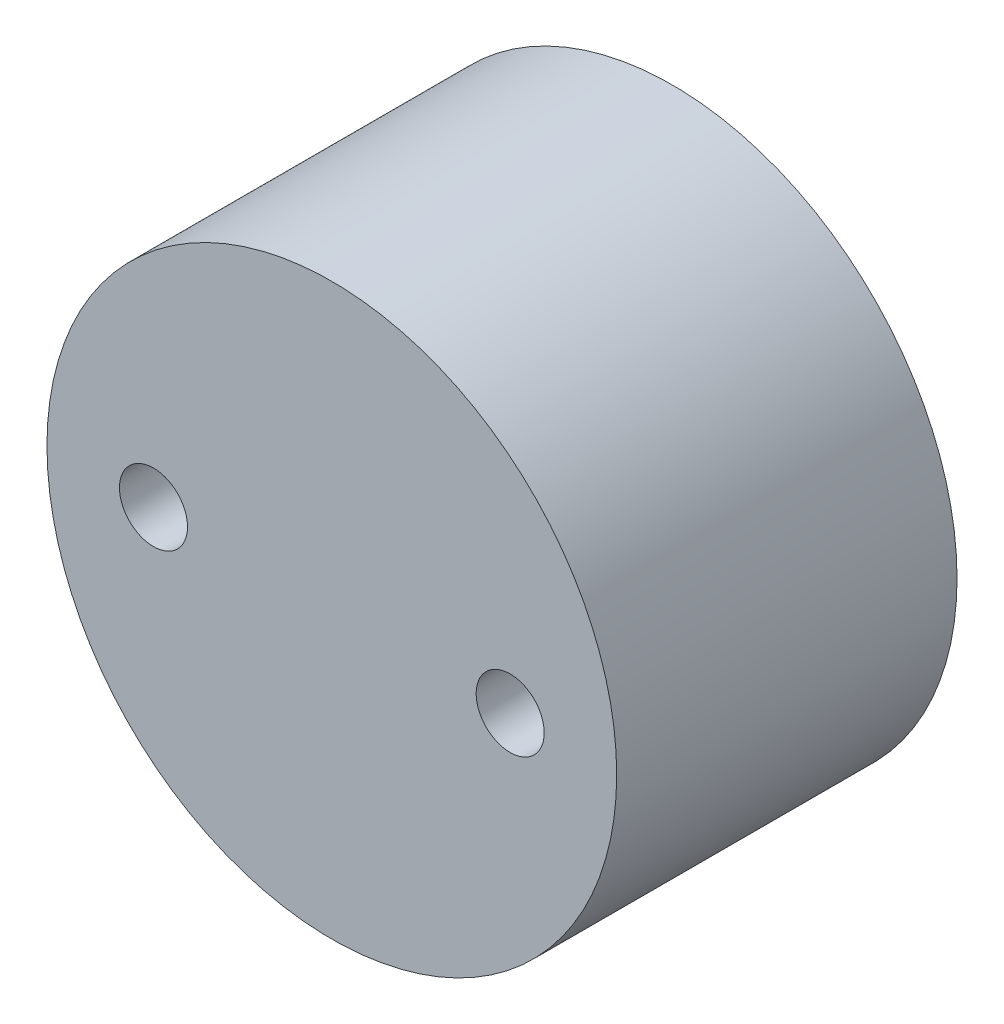
ISO-10303-21;
HEADER;
FILE_DESCRIPTION(('STEP AP214'),'2;1');
FILE_NAME('part.step','',(''),(''),'','','');
FILE_SCHEMA(('AUTOMOTIVE_DESIGN { 1 0 10303 214 1 1 1 1 }'));
ENDSEC;
DATA;
#1=APPLICATION_CONTEXT('core data for automotive mechanical design processes');
#2=APPLICATION_PROTOCOL_DEFINITION('international standard','automotive_design',2000,#1);
#3=PRODUCT_CONTEXT('',#1,'mechanical');
#4=PRODUCT('Part','Part','',(#3));
#5=PRODUCT_RELATED_PRODUCT_CATEGORY('part','',(#4));
#6=PRODUCT_DEFINITION_FORMATION('','',#4);
#7=PRODUCT_DEFINITION_CONTEXT('part definition',#1,'design');
#8=PRODUCT_DEFINITION('design','',#6,#7);
#9=PRODUCT_DEFINITION_SHAPE('','',#8);
#10=(LENGTH_UNIT() NAMED_UNIT(*) SI_UNIT(.MILLI.,.METRE.));
#11=(NAMED_UNIT(*) PLANE_ANGLE_UNIT() SI_UNIT($,.RADIAN.));
#12=(NAMED_UNIT(*) SI_UNIT($,.STERADIAN.) SOLID_ANGLE_UNIT());
#13=UNCERTAINTY_MEASURE_WITH_UNIT(LENGTH_MEASURE(1.E-05),#10,'distance_accuracy_value','');
#14=(GEOMETRIC_REPRESENTATION_CONTEXT(3) GLOBAL_UNCERTAINTY_ASSIGNED_CONTEXT((#13)) GLOBAL_UNIT_ASSIGNED_CONTEXT((#10,
#11,#12)) REPRESENTATION_CONTEXT('',''));
#15=CARTESIAN_POINT('',(0.,0.,0.));
#16=DIRECTION('',(0.,0.,1.));
#17=DIRECTION('',(1.,0.,0.));
#18=AXIS2_PLACEMENT_3D('',#15,#16,#17);
#19=CARTESIAN_POINT('',(0.,0.,5.));
#20=DIRECTION('',(0.,0.,-1.));
#21=DIRECTION('',(-1.,0.,0.));
#22=AXIS2_PLACEMENT_3D('',#19,#20,#21);
#23=CYLINDRICAL_SURFACE('',#22,4.185);
#24=CARTESIAN_POINT('',(0.,0.,5.));
#25=DIRECTION('',(0.,0.,1.));
#26=DIRECTION('',(1.,0.,0.));
#27=AXIS2_PLACEMENT_3D('',#24,#25,#26);
#28=CIRCLE('',#27,4.185);
#29=CARTESIAN_POINT('',(4.185,0.,5.));
#30=VERTEX_POINT('',#29);
#31=EDGE_CURVE('E10',#30,#30,#28,.T.);
#32=ORIENTED_EDGE('',*,*,#31,.F.);
#33=EDGE_LOOP('',(#32));
#34=FACE_BOUND('',#33,.T.);
#35=CARTESIAN_POINT('',(0.,0.,0.));
#36=DIRECTION('',(0.,0.,1.));
#37=DIRECTION('',(1.,0.,0.));
#38=AXIS2_PLACEMENT_3D('',#35,#36,#37);
#39=CIRCLE('',#38,4.185);
#40=CARTESIAN_POINT('',(4.185,0.,0.));
#41=VERTEX_POINT('',#40);
#42=EDGE_CURVE('E46',#41,#41,#39,.T.);
#43=ORIENTED_EDGE('',*,*,#42,.T.);
#44=EDGE_LOOP('',(#43));
#45=FACE_BOUND('',#44,.T.);
#46=ADVANCED_FACE('F43',(#34,#45),#23,.T.);
#47=CARTESIAN_POINT('',(0.,0.,5.));
#48=DIRECTION('',(0.,0.,1.));
#49=DIRECTION('',(1.,0.,0.));
#50=AXIS2_PLACEMENT_3D('',#47,#48,#49);
#51=PLANE('',#50);
#52=CARTESIAN_POINT('',(-2.62,0.,5.));
#53=DIRECTION('',(0.,0.,1.));
#54=DIRECTION('',(1.,0.,0.));
#55=AXIS2_PLACEMENT_3D('',#52,#53,#54);
#56=CIRCLE('',#55,0.5);
#57=CARTESIAN_POINT('',(-2.12,0.,5.));
#58=VERTEX_POINT('',#57);
#59=EDGE_CURVE('E65',#58,#58,#56,.T.);
#60=ORIENTED_EDGE('',*,*,#59,.F.);
#61=EDGE_LOOP('',(#60));
#62=FACE_BOUND('',#61,.T.);
#63=CARTESIAN_POINT('',(2.62,0.,5.));
#64=DIRECTION('',(0.,0.,1.));
#65=DIRECTION('',(-1.,0.,0.));
#66=AXIS2_PLACEMENT_3D('',#63,#64,#65);
#67=CIRCLE('',#66,0.5);
#68=CARTESIAN_POINT('',(2.12,0.,5.));
#69=VERTEX_POINT('',#68);
#70=EDGE_CURVE('E61',#69,#69,#67,.T.);
#71=ORIENTED_EDGE('',*,*,#70,.F.);
#72=EDGE_LOOP('',(#71));
#73=FACE_BOUND('',#72,.T.);
#74=ORIENTED_EDGE('',*,*,#31,.T.);
#75=EDGE_LOOP('',(#74));
#76=FACE_BOUND('',#75,.T.);
#77=ADVANCED_FACE('F83',(#62,#73,#76),#51,.T.);
#78=CARTESIAN_POINT('',(0.,0.,0.));
#79=DIRECTION('',(0.,0.,1.));
#80=DIRECTION('',(1.,0.,0.));
#81=AXIS2_PLACEMENT_3D('',#78,#79,#80);
#82=PLANE('',#81);
#83=CARTESIAN_POINT('',(-2.62,0.,0.));
#84=DIRECTION('',(0.,0.,1.));
#85=DIRECTION('',(1.,0.,0.));
#86=AXIS2_PLACEMENT_3D('',#83,#84,#85);
#87=CIRCLE('',#86,0.5);
#88=CARTESIAN_POINT('',(-2.12,0.,0.));
#89=VERTEX_POINT('',#88);
#90=EDGE_CURVE('E55',#89,#89,#87,.T.);
#91=ORIENTED_EDGE('',*,*,#90,.T.);
#92=EDGE_LOOP('',(#91));
#93=FACE_BOUND('',#92,.T.);
#94=CARTESIAN_POINT('',(2.62,0.,0.));
#95=DIRECTION('',(0.,0.,1.));
#96=DIRECTION('',(-1.,0.,0.));
#97=AXIS2_PLACEMENT_3D('',#94,#95,#96);
#98=CIRCLE('',#97,0.5);
#99=CARTESIAN_POINT('',(2.12,0.,0.));
#100=VERTEX_POINT('',#99);
#101=EDGE_CURVE('E57',#100,#100,#98,.T.);
#102=ORIENTED_EDGE('',*,*,#101,.T.);
#103=EDGE_LOOP('',(#102));
#104=FACE_BOUND('',#103,.T.);
#105=ORIENTED_EDGE('',*,*,#42,.F.);
#106=EDGE_LOOP('',(#105));
#107=FACE_BOUND('',#106,.T.);
#108=ADVANCED_FACE('F73',(#93,#104,#107),#82,.F.);
#109=CARTESIAN_POINT('',(2.62,0.,0.));
#110=DIRECTION('',(0.,0.,1.));
#111=DIRECTION('',(1.,0.,0.));
#112=AXIS2_PLACEMENT_3D('',#109,#110,#111);
#113=CYLINDRICAL_SURFACE('',#112,0.5);
#114=ORIENTED_EDGE('',*,*,#101,.F.);
#115=EDGE_LOOP('',(#114));
#116=FACE_BOUND('',#115,.T.);
#117=ORIENTED_EDGE('',*,*,#70,.T.);
#118=EDGE_LOOP('',(#117));
#119=FACE_BOUND('',#118,.T.);
#120=ADVANCED_FACE('F79',(#116,#119),#113,.F.);
#121=CARTESIAN_POINT('',(-2.62,0.,0.));
#122=DIRECTION('',(0.,0.,1.));
#123=DIRECTION('',(1.,0.,0.));
#124=AXIS2_PLACEMENT_3D('',#121,#122,#123);
#125=CYLINDRICAL_SURFACE('',#124,0.5);
#126=ORIENTED_EDGE('',*,*,#90,.F.);
#127=EDGE_LOOP('',(#126));
#128=FACE_BOUND('',#127,.T.);
#129=ORIENTED_EDGE('',*,*,#59,.T.);
#130=EDGE_LOOP('',(#129));
#131=FACE_BOUND('',#130,.T.);
#132=ADVANCED_FACE('F76',(#128,#131),#125,.F.);
#133=CLOSED_SHELL('',(#46,#77,#108,#120,#132));
#134=MANIFOLD_SOLID_BREP('B2',#133);
#135=ADVANCED_BREP_SHAPE_REPRESENTATION('',(#18,#134),#14);
#136=SHAPE_DEFINITION_REPRESENTATION(#9,#135);
ENDSEC;
END-ISO-10303-21;
